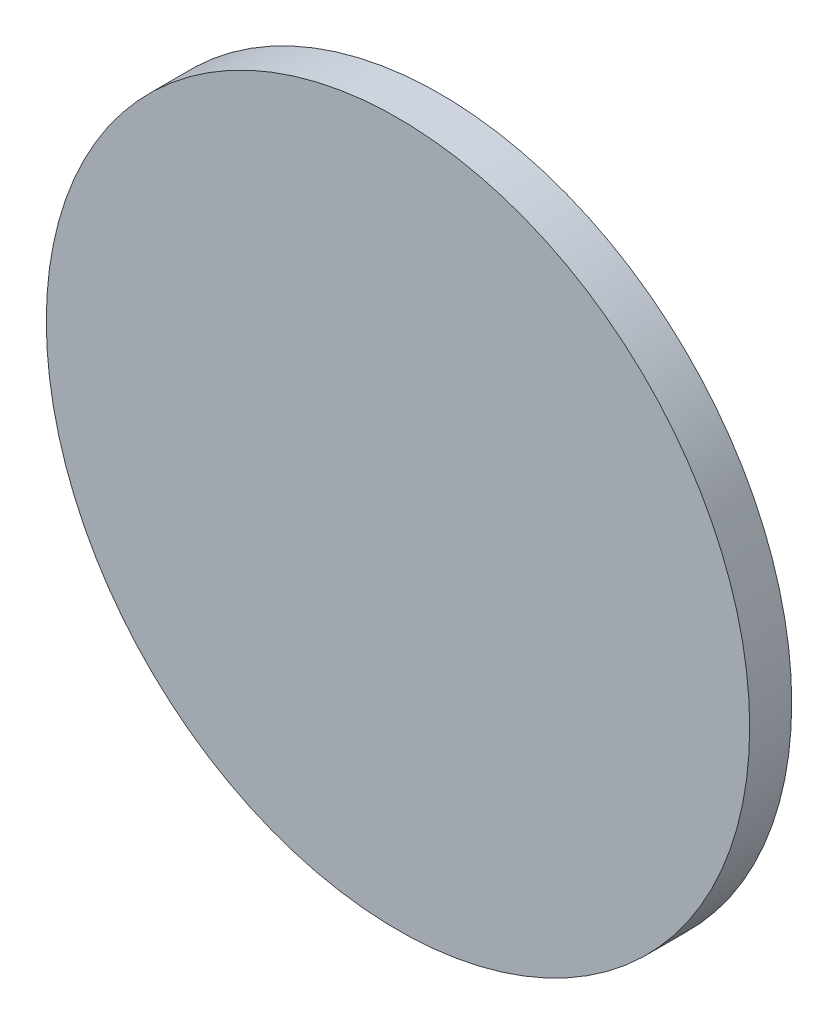
ISO-10303-21;
HEADER;
FILE_DESCRIPTION(('STEP AP214'),'2;1');
FILE_NAME('part.step','',(''),(''),'','','');
FILE_SCHEMA(('AUTOMOTIVE_DESIGN { 1 0 10303 214 1 1 1 1 }'));
ENDSEC;
DATA;
#1=APPLICATION_CONTEXT('core data for automotive mechanical design processes');
#2=APPLICATION_PROTOCOL_DEFINITION('international standard','automotive_design',2000,#1);
#3=PRODUCT_CONTEXT('',#1,'mechanical');
#4=PRODUCT('Part','Part','',(#3));
#5=PRODUCT_RELATED_PRODUCT_CATEGORY('part','',(#4));
#6=PRODUCT_DEFINITION_FORMATION('','',#4);
#7=PRODUCT_DEFINITION_CONTEXT('part definition',#1,'design');
#8=PRODUCT_DEFINITION('design','',#6,#7);
#9=PRODUCT_DEFINITION_SHAPE('','',#8);
#10=(LENGTH_UNIT() NAMED_UNIT(*) SI_UNIT(.MILLI.,.METRE.));
#11=(NAMED_UNIT(*) PLANE_ANGLE_UNIT() SI_UNIT($,.RADIAN.));
#12=(NAMED_UNIT(*) SI_UNIT($,.STERADIAN.) SOLID_ANGLE_UNIT());
#13=UNCERTAINTY_MEASURE_WITH_UNIT(LENGTH_MEASURE(1.E-05),#10,'distance_accuracy_value','');
#14=(GEOMETRIC_REPRESENTATION_CONTEXT(3) GLOBAL_UNCERTAINTY_ASSIGNED_CONTEXT((#13)) GLOBAL_UNIT_ASSIGNED_CONTEXT((#10,
#11,#12)) REPRESENTATION_CONTEXT('',''));
#15=CARTESIAN_POINT('',(0.,0.,0.));
#16=DIRECTION('',(0.,0.,1.));
#17=DIRECTION('',(1.,0.,0.));
#18=AXIS2_PLACEMENT_3D('',#15,#16,#17);
#19=CARTESIAN_POINT('',(0.,0.,3.));
#20=DIRECTION('',(0.,0.,-1.));
#21=DIRECTION('',(-1.,0.,0.));
#22=AXIS2_PLACEMENT_3D('',#19,#20,#21);
#23=CYLINDRICAL_SURFACE('',#22,25.1);
#24=CARTESIAN_POINT('',(0.,0.,3.));
#25=DIRECTION('',(0.,0.,1.));
#26=DIRECTION('',(1.,0.,0.));
#27=AXIS2_PLACEMENT_3D('',#24,#25,#26);
#28=CIRCLE('',#27,25.1);
#29=CARTESIAN_POINT('',(25.1,0.,3.));
#30=VERTEX_POINT('',#29);
#31=EDGE_CURVE('E10',#30,#30,#28,.T.);
#32=ORIENTED_EDGE('',*,*,#31,.F.);
#33=EDGE_LOOP('',(#32));
#34=FACE_BOUND('',#33,.T.);
#35=CARTESIAN_POINT('',(0.,0.,0.));
#36=DIRECTION('',(0.,0.,1.));
#37=DIRECTION('',(1.,0.,0.));
#38=AXIS2_PLACEMENT_3D('',#35,#36,#37);
#39=CIRCLE('',#38,25.1);
#40=CARTESIAN_POINT('',(25.1,0.,0.));
#41=VERTEX_POINT('',#40);
#42=EDGE_CURVE('E40',#41,#41,#39,.T.);
#43=ORIENTED_EDGE('',*,*,#42,.T.);
#44=EDGE_LOOP('',(#43));
#45=FACE_BOUND('',#44,.T.);
#46=ADVANCED_FACE('F37',(#34,#45),#23,.T.);
#47=CARTESIAN_POINT('',(0.,0.,3.));
#48=DIRECTION('',(0.,0.,1.));
#49=DIRECTION('',(1.,0.,0.));
#50=AXIS2_PLACEMENT_3D('',#47,#48,#49);
#51=PLANE('',#50);
#52=ORIENTED_EDGE('',*,*,#31,.T.);
#53=EDGE_LOOP('',(#52));
#54=FACE_BOUND('',#53,.T.);
#55=ADVANCED_FACE('F54',(#54),#51,.T.);
#56=CARTESIAN_POINT('',(0.,0.,0.));
#57=DIRECTION('',(0.,0.,1.));
#58=DIRECTION('',(1.,0.,0.));
#59=AXIS2_PLACEMENT_3D('',#56,#57,#58);
#60=PLANE('',#59);
#61=ORIENTED_EDGE('',*,*,#42,.F.);
#62=EDGE_LOOP('',(#61));
#63=FACE_BOUND('',#62,.T.);
#64=ADVANCED_FACE('F52',(#63),#60,.F.);
#65=CLOSED_SHELL('',(#46,#55,#64));
#66=MANIFOLD_SOLID_BREP('B2',#65);
#67=ADVANCED_BREP_SHAPE_REPRESENTATION('',(#18,#66),#14);
#68=SHAPE_DEFINITION_REPRESENTATION(#9,#67);
ENDSEC;
END-ISO-10303-21;
